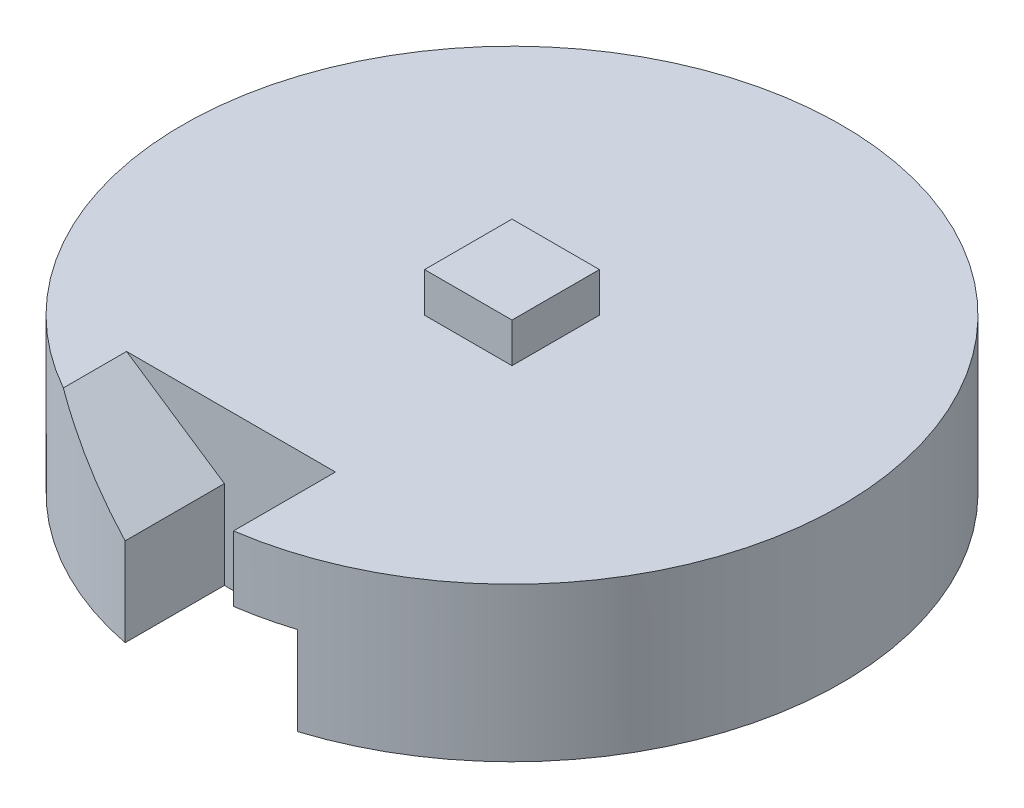
ISO-10303-21;
HEADER;
FILE_DESCRIPTION(('STEP AP214'),'2;1');
FILE_NAME('part.step','',(''),(''),'','','');
FILE_SCHEMA(('AUTOMOTIVE_DESIGN { 1 0 10303 214 1 1 1 1 }'));
ENDSEC;
DATA;
#1=APPLICATION_CONTEXT('core data for automotive mechanical design processes');
#2=APPLICATION_PROTOCOL_DEFINITION('international standard','automotive_design',2000,#1);
#3=PRODUCT_CONTEXT('',#1,'mechanical');
#4=PRODUCT('Part','Part','',(#3));
#5=PRODUCT_RELATED_PRODUCT_CATEGORY('part','',(#4));
#6=PRODUCT_DEFINITION_FORMATION('','',#4);
#7=PRODUCT_DEFINITION_CONTEXT('part definition',#1,'design');
#8=PRODUCT_DEFINITION('design','',#6,#7);
#9=PRODUCT_DEFINITION_SHAPE('','',#8);
#10=(LENGTH_UNIT() NAMED_UNIT(*) SI_UNIT(.MILLI.,.METRE.));
#11=(NAMED_UNIT(*) PLANE_ANGLE_UNIT() SI_UNIT($,.RADIAN.));
#12=(NAMED_UNIT(*) SI_UNIT($,.STERADIAN.) SOLID_ANGLE_UNIT());
#13=UNCERTAINTY_MEASURE_WITH_UNIT(LENGTH_MEASURE(1.E-05),#10,'distance_accuracy_value','');
#14=(GEOMETRIC_REPRESENTATION_CONTEXT(3) GLOBAL_UNCERTAINTY_ASSIGNED_CONTEXT((#13)) GLOBAL_UNIT_ASSIGNED_CONTEXT((#10,
#11,#12)) REPRESENTATION_CONTEXT('',''));
#15=CARTESIAN_POINT('',(0.,0.,0.));
#16=DIRECTION('',(0.,0.,1.));
#17=DIRECTION('',(1.,0.,0.));
#18=AXIS2_PLACEMENT_3D('',#15,#16,#17);
#19=CARTESIAN_POINT('',(0.,17.5,0.));
#20=DIRECTION('',(0.,1.,0.));
#21=DIRECTION('',(0.,0.,1.));
#22=AXIS2_PLACEMENT_3D('',#19,#20,#21);
#23=PLANE('',#22);
#24=DIRECTION('',(0.,0.,-1.));
#25=VECTOR('',#24,1.);
#26=CARTESIAN_POINT('',(5.40916797594821,17.5,0.));
#27=LINE('',#26,#25);
#28=CARTESIAN_POINT('',(5.40916797594821,17.5,37.1078280394848));
#29=VERTEX_POINT('',#28);
#30=CARTESIAN_POINT('',(5.40916797594821,17.5,25.5));
#31=VERTEX_POINT('',#30);
#32=EDGE_CURVE('E457',#29,#31,#27,.T.);
#33=ORIENTED_EDGE('',*,*,#32,.F.);
#34=CARTESIAN_POINT('',(0.,17.5,0.));
#35=DIRECTION('',(0.,1.,0.));
#36=DIRECTION('',(0.,0.,1.));
#37=AXIS2_PLACEMENT_3D('',#34,#35,#36);
#38=CIRCLE('',#37,37.5);
#39=CARTESIAN_POINT('',(-18.3618136354973,17.5,32.6969998626061));
#40=VERTEX_POINT('',#39);
#41=EDGE_CURVE('E436',#29,#40,#38,.T.);
#42=ORIENTED_EDGE('',*,*,#41,.T.);
#43=DIRECTION('',(0.,0.,1.));
#44=VECTOR('',#43,1.);
#45=CARTESIAN_POINT('',(-18.3618136354973,17.5,0.));
#46=LINE('',#45,#44);
#47=CARTESIAN_POINT('',(-18.3618136354973,17.5,25.5));
#48=VERTEX_POINT('',#47);
#49=EDGE_CURVE('E454',#48,#40,#46,.T.);
#50=ORIENTED_EDGE('',*,*,#49,.F.);
#51=DIRECTION('',(1.,0.,0.));
#52=VECTOR('',#51,1.);
#53=CARTESIAN_POINT('',(0.,17.5,25.5));
#54=LINE('',#53,#52);
#55=EDGE_CURVE('E408',#48,#31,#54,.T.);
#56=ORIENTED_EDGE('',*,*,#55,.T.);
#57=EDGE_LOOP('',(#33,#42,#50,#56));
#58=FACE_BOUND('',#57,.T.);
#59=DIRECTION('',(1.,0.,0.));
#60=VECTOR('',#59,1.);
#61=CARTESIAN_POINT('',(0.,17.5,-4.975));
#62=LINE('',#61,#60);
#63=CARTESIAN_POINT('',(-4.975,17.5,-4.975));
#64=VERTEX_POINT('',#63);
#65=CARTESIAN_POINT('',(4.975,17.5,-4.975));
#66=VERTEX_POINT('',#65);
#67=EDGE_CURVE('E378',#64,#66,#62,.T.);
#68=ORIENTED_EDGE('',*,*,#67,.T.);
#69=DIRECTION('',(0.,0.,1.));
#70=VECTOR('',#69,1.);
#71=CARTESIAN_POINT('',(4.975,17.5,0.));
#72=LINE('',#71,#70);
#73=CARTESIAN_POINT('',(4.975,17.5,4.975));
#74=VERTEX_POINT('',#73);
#75=EDGE_CURVE('E382',#66,#74,#72,.T.);
#76=ORIENTED_EDGE('',*,*,#75,.T.);
#77=DIRECTION('',(-1.,0.,0.));
#78=VECTOR('',#77,1.);
#79=CARTESIAN_POINT('',(0.,17.5,4.975));
#80=LINE('',#79,#78);
#81=CARTESIAN_POINT('',(-4.975,17.5,4.975));
#82=VERTEX_POINT('',#81);
#83=EDGE_CURVE('E370',#74,#82,#80,.T.);
#84=ORIENTED_EDGE('',*,*,#83,.T.);
#85=DIRECTION('',(0.,0.,-1.));
#86=VECTOR('',#85,1.);
#87=CARTESIAN_POINT('',(-4.975,17.5,0.));
#88=LINE('',#87,#86);
#89=EDGE_CURVE('E374',#82,#64,#88,.T.);
#90=ORIENTED_EDGE('',*,*,#89,.T.);
#91=EDGE_LOOP('',(#68,#76,#84,#90));
#92=FACE_BOUND('',#91,.T.);
#93=ADVANCED_FACE('F69',(#58,#92),#23,.T.);
#94=CARTESIAN_POINT('',(0.,17.5,0.));
#95=DIRECTION('',(0.,-1.,0.));
#96=DIRECTION('',(0.,0.,-1.));
#97=AXIS2_PLACEMENT_3D('',#94,#95,#96);
#98=CYLINDRICAL_SURFACE('',#97,37.5);
#99=ORIENTED_EDGE('',*,*,#41,.F.);
#100=DIRECTION('',(0.,-1.,0.));
#101=VECTOR('',#100,1.);
#102=CARTESIAN_POINT('',(5.40916797594821,17.5,37.1078280394848));
#103=LINE('',#102,#101);
#104=CARTESIAN_POINT('',(5.40916797594821,10.0586939101936,37.1078280394848));
#105=VERTEX_POINT('',#104);
#106=EDGE_CURVE('E431',#29,#105,#103,.T.);
#107=ORIENTED_EDGE('',*,*,#106,.T.);
#108=CARTESIAN_POINT('',(0.,10.0586939101936,0.));
#109=DIRECTION('',(0.,1.,0.));
#110=DIRECTION('',(0.,0.,1.));
#111=AXIS2_PLACEMENT_3D('',#108,#109,#110);
#112=CIRCLE('',#111,37.5);
#113=CARTESIAN_POINT('',(11.3377548552186,10.0586939101936,35.7450040543146));
#114=VERTEX_POINT('',#113);
#115=EDGE_CURVE('E78',#105,#114,#112,.T.);
#116=ORIENTED_EDGE('',*,*,#115,.T.);
#117=DIRECTION('',(0.,-1.,0.));
#118=VECTOR('',#117,1.);
#119=CARTESIAN_POINT('',(11.3377548552186,17.5,35.7450040543146));
#120=LINE('',#119,#118);
#121=CARTESIAN_POINT('',(11.3377548552186,0.,35.7450040543146));
#122=VERTEX_POINT('',#121);
#123=EDGE_CURVE('E423',#114,#122,#120,.T.);
#124=ORIENTED_EDGE('',*,*,#123,.T.);
#125=CARTESIAN_POINT('',(0.,0.,0.));
#126=DIRECTION('',(0.,1.,0.));
#127=DIRECTION('',(0.,0.,1.));
#128=AXIS2_PLACEMENT_3D('',#125,#126,#127);
#129=CIRCLE('',#128,37.5);
#130=CARTESIAN_POINT('',(-7.23202995206033,0.,36.7960288994954));
#131=VERTEX_POINT('',#130);
#132=EDGE_CURVE('E435',#122,#131,#129,.T.);
#133=ORIENTED_EDGE('',*,*,#132,.T.);
#134=DIRECTION('',(0.,-1.,0.));
#135=VECTOR('',#134,1.);
#136=CARTESIAN_POINT('',(-7.23202995206033,17.5,36.7960288994954));
#137=LINE('',#136,#135);
#138=CARTESIAN_POINT('',(-7.23202995206033,10.0401319165543,36.7960288994954));
#139=VERTEX_POINT('',#138);
#140=EDGE_CURVE('E419',#131,#139,#137,.F.);
#141=ORIENTED_EDGE('',*,*,#140,.T.);
#142=CARTESIAN_POINT('',(0.,5.19277899825944,0.));
#143=DIRECTION('',(-0.556765929579434,-0.830669428629433,0.));
#144=DIRECTION('',(0.830669428629433,-0.556765929579434,0.));
#145=AXIS2_PLACEMENT_3D('',#142,#143,#144);
#146=ELLIPSE('',#145,45.1443121746677,37.5);
#147=EDGE_CURVE('E427',#139,#40,#146,.T.);
#148=ORIENTED_EDGE('',*,*,#147,.T.);
#149=EDGE_LOOP('',(#99,#107,#116,#124,#133,#141,#148));
#150=FACE_BOUND('',#149,.T.);
#151=ADVANCED_FACE('F71',(#150),#98,.T.);
#152=CARTESIAN_POINT('',(0.,0.,0.));
#153=DIRECTION('',(0.,1.,0.));
#154=DIRECTION('',(0.,0.,1.));
#155=AXIS2_PLACEMENT_3D('',#152,#153,#154);
#156=PLANE('',#155);
#157=CARTESIAN_POINT('',(-29.9819884688496,0.,0.00676759727533257));
#158=DIRECTION('',(0.,-1.,0.));
#159=DIRECTION('',(0.,0.,-1.));
#160=AXIS2_PLACEMENT_3D('',#157,#158,#159);
#161=CIRCLE('',#160,3.025);
#162=CARTESIAN_POINT('',(-32.9953264854656,0.,0.272133378069444));
#163=VERTEX_POINT('',#162);
#164=CARTESIAN_POINT('',(-28.4488050560511,0.,2.61444350173884));
#165=VERTEX_POINT('',#164);
#166=EDGE_CURVE('E85',#163,#165,#161,.T.);
#167=ORIENTED_EDGE('',*,*,#166,.F.);
#168=DIRECTION('',(1.,0.,0.));
#169=VECTOR('',#168,1.);
#170=CARTESIAN_POINT('',(-33.1249528963565,0.,0.272133378069444));
#171=LINE('',#170,#169);
#172=CARTESIAN_POINT('',(-33.1249528963565,0.,0.272133378069444));
#173=VERTEX_POINT('',#172);
#174=EDGE_CURVE('E269',#173,#163,#171,.T.);
#175=ORIENTED_EDGE('',*,*,#174,.F.);
#176=DIRECTION('',(-0.5355378334719,0.,-0.844511236704535));
#177=VECTOR('',#176,1.);
#178=CARTESIAN_POINT('',(-29.9819884688496,0.,5.22840090894499));
#179=LINE('',#178,#177);
#180=CARTESIAN_POINT('',(-32.961379359042,0.,0.530079094796873));
#181=VERTEX_POINT('',#180);
#182=EDGE_CURVE('E245',#181,#173,#179,.T.);
#183=ORIENTED_EDGE('',*,*,#182,.F.);
#184=CARTESIAN_POINT('',(-31.7257499433556,0.,2.47859301991921));
#185=VERTEX_POINT('',#184);
#186=EDGE_CURVE('E224',#185,#181,#161,.T.);
#187=ORIENTED_EDGE('',*,*,#186,.F.);
#188=CARTESIAN_POINT('',(-29.9819884688496,0.,5.22840090894499));
#189=VERTEX_POINT('',#188);
#190=EDGE_CURVE('E237',#189,#185,#179,.T.);
#191=ORIENTED_EDGE('',*,*,#190,.F.);
#192=DIRECTION('',(-0.505931566726971,0.,0.862573619924231));
#193=VECTOR('',#192,1.);
#194=CARTESIAN_POINT('',(-27.0749528963565,0.,0.272133378069444));
#195=LINE('',#194,#193);
#196=EDGE_CURVE('E273',#165,#189,#195,.T.);
#197=ORIENTED_EDGE('',*,*,#196,.F.);
#198=EDGE_LOOP('',(#167,#175,#183,#187,#191,#197));
#199=FACE_BOUND('',#198,.T.);
#200=DIRECTION('',(-0.501278161939866,0.,0.865286197949666));
#201=VECTOR('',#200,1.);
#202=CARTESIAN_POINT('',(33.0430115311504,0.,0.00676759727533624));
#203=LINE('',#202,#201);
#204=CARTESIAN_POINT('',(31.5227687675417,0.,2.6309495001792));
#205=VERTEX_POINT('',#204);
#206=CARTESIAN_POINT('',(30.0180115311504,0.,5.22840090894499));
#207=VERTEX_POINT('',#206);
#208=EDGE_CURVE('E302',#205,#207,#203,.T.);
#209=ORIENTED_EDGE('',*,*,#208,.F.);
#210=CARTESIAN_POINT('',(30.0180115311504,0.,0.00676759727533624));
#211=DIRECTION('',(0.,-1.,0.));
#212=DIRECTION('',(0.,0.,-1.));
#213=AXIS2_PLACEMENT_3D('',#210,#211,#212);
#214=CIRCLE('',#213,3.025);
#215=CARTESIAN_POINT('',(28.5132542947592,0.,2.63094950017921));
#216=VERTEX_POINT('',#215);
#217=EDGE_CURVE('E301',#216,#205,#214,.T.);
#218=ORIENTED_EDGE('',*,*,#217,.F.);
#219=DIRECTION('',(-0.501278161939866,0.,-0.865286197949666));
#220=VECTOR('',#219,1.);
#221=CARTESIAN_POINT('',(30.0180115311504,0.,5.22840090894499));
#222=LINE('',#221,#220);
#223=EDGE_CURVE('E274',#207,#216,#222,.T.);
#224=ORIENTED_EDGE('',*,*,#223,.F.);
#225=EDGE_LOOP('',(#209,#218,#224));
#226=FACE_BOUND('',#225,.T.);
#227=CARTESIAN_POINT('',(0.,0.,0.));
#228=DIRECTION('',(0.,1.,0.));
#229=DIRECTION('',(0.,0.,1.));
#230=AXIS2_PLACEMENT_3D('',#227,#228,#229);
#231=CIRCLE('',#230,5.);
#232=CARTESIAN_POINT('',(0.,0.,5.));
#233=VERTEX_POINT('',#232);
#234=EDGE_CURVE('E12',#233,#233,#231,.F.);
#235=ORIENTED_EDGE('',*,*,#234,.F.);
#236=EDGE_LOOP('',(#235));
#237=FACE_BOUND('',#236,.T.);
#238=ORIENTED_EDGE('',*,*,#132,.F.);
#239=DIRECTION('',(0.,0.,-1.));
#240=VECTOR('',#239,1.);
#241=CARTESIAN_POINT('',(11.3377548552186,0.,0.));
#242=LINE('',#241,#240);
#243=CARTESIAN_POINT('',(11.3377548552186,0.,25.5));
#244=VERTEX_POINT('',#243);
#245=EDGE_CURVE('E450',#122,#244,#242,.T.);
#246=ORIENTED_EDGE('',*,*,#245,.T.);
#247=DIRECTION('',(1.,0.,0.));
#248=VECTOR('',#247,1.);
#249=CARTESIAN_POINT('',(0.,0.,25.5));
#250=LINE('',#249,#248);
#251=CARTESIAN_POINT('',(-7.23202995206033,0.,25.5));
#252=VERTEX_POINT('',#251);
#253=EDGE_CURVE('E440',#252,#244,#250,.T.);
#254=ORIENTED_EDGE('',*,*,#253,.F.);
#255=DIRECTION('',(0.,0.,1.));
#256=VECTOR('',#255,1.);
#257=CARTESIAN_POINT('',(-7.23202995206033,0.,0.));
#258=LINE('',#257,#256);
#259=EDGE_CURVE('E446',#252,#131,#258,.T.);
#260=ORIENTED_EDGE('',*,*,#259,.T.);
#261=EDGE_LOOP('',(#238,#246,#254,#260));
#262=FACE_BOUND('',#261,.T.);
#263=ADVANCED_FACE('F247',(#199,#226,#237,#262),#156,.F.);
#264=CARTESIAN_POINT('',(5.40916797594821,10.0586939101936,25.5));
#265=DIRECTION('',(0.,1.,0.));
#266=DIRECTION('',(0.,0.,1.));
#267=AXIS2_PLACEMENT_3D('',#264,#265,#266);
#268=PLANE('',#267);
#269=DIRECTION('',(0.,0.,1.));
#270=VECTOR('',#269,1.);
#271=CARTESIAN_POINT('',(5.40916797594821,10.0586939101936,25.5));
#272=LINE('',#271,#270);
#273=CARTESIAN_POINT('',(5.40916797594821,10.0586939101936,25.5));
#274=VERTEX_POINT('',#273);
#275=EDGE_CURVE('E404',#274,#105,#272,.T.);
#276=ORIENTED_EDGE('',*,*,#275,.F.);
#277=DIRECTION('',(-1.,0.,0.));
#278=VECTOR('',#277,1.);
#279=CARTESIAN_POINT('',(5.40916797594821,10.0586939101936,25.5));
#280=LINE('',#279,#278);
#281=CARTESIAN_POINT('',(11.3377548552186,10.0586939101936,25.5));
#282=VERTEX_POINT('',#281);
#283=EDGE_CURVE('E399',#282,#274,#280,.T.);
#284=ORIENTED_EDGE('',*,*,#283,.F.);
#285=DIRECTION('',(0.,0.,1.));
#286=VECTOR('',#285,1.);
#287=CARTESIAN_POINT('',(11.3377548552186,10.0586939101936,25.5));
#288=LINE('',#287,#286);
#289=EDGE_CURVE('E409',#282,#114,#288,.T.);
#290=ORIENTED_EDGE('',*,*,#289,.T.);
#291=ORIENTED_EDGE('',*,*,#115,.F.);
#292=EDGE_LOOP('',(#276,#284,#290,#291));
#293=FACE_BOUND('',#292,.T.);
#294=ADVANCED_FACE('F465',(#293),#268,.F.);
#295=CARTESIAN_POINT('',(5.40916797594821,17.669921882635,25.5));
#296=DIRECTION('',(1.,0.,0.));
#297=DIRECTION('',(0.,1.,0.));
#298=AXIS2_PLACEMENT_3D('',#295,#296,#297);
#299=PLANE('',#298);
#300=ORIENTED_EDGE('',*,*,#32,.T.);
#301=DIRECTION('',(0.,1.,0.));
#302=VECTOR('',#301,1.);
#303=CARTESIAN_POINT('',(5.40916797594821,17.669921882635,25.5));
#304=LINE('',#303,#302);
#305=EDGE_CURVE('E386',#274,#31,#304,.T.);
#306=ORIENTED_EDGE('',*,*,#305,.F.);
#307=ORIENTED_EDGE('',*,*,#275,.T.);
#308=ORIENTED_EDGE('',*,*,#106,.F.);
#309=EDGE_LOOP('',(#300,#306,#307,#308));
#310=FACE_BOUND('',#309,.T.);
#311=ADVANCED_FACE('F470',(#310),#299,.F.);
#312=CARTESIAN_POINT('',(-18.6153293512788,17.669921882635,25.5));
#313=DIRECTION('',(-0.556765929579434,-0.830669428629433,0.));
#314=DIRECTION('',(0.830669428629433,-0.556765929579434,0.));
#315=AXIS2_PLACEMENT_3D('',#312,#313,#314);
#316=PLANE('',#315);
#317=DIRECTION('',(0.,0.,1.));
#318=VECTOR('',#317,1.);
#319=CARTESIAN_POINT('',(-7.23202995206033,10.0401319165543,25.5));
#320=LINE('',#319,#318);
#321=CARTESIAN_POINT('',(-7.23202995206033,10.0401319165543,25.5));
#322=VERTEX_POINT('',#321);
#323=EDGE_CURVE('E403',#322,#139,#320,.T.);
#324=ORIENTED_EDGE('',*,*,#323,.F.);
#325=DIRECTION('',(0.830669428629433,-0.556765929579434,0.));
#326=VECTOR('',#325,1.);
#327=CARTESIAN_POINT('',(-18.6153293512788,17.669921882635,25.5));
#328=LINE('',#327,#326);
#329=EDGE_CURVE('E390',#48,#322,#328,.T.);
#330=ORIENTED_EDGE('',*,*,#329,.F.);
#331=ORIENTED_EDGE('',*,*,#49,.T.);
#332=ORIENTED_EDGE('',*,*,#147,.F.);
#333=EDGE_LOOP('',(#324,#330,#331,#332));
#334=FACE_BOUND('',#333,.T.);
#335=ADVANCED_FACE('F486',(#334),#316,.F.);
#336=CARTESIAN_POINT('',(11.3377548552186,10.0586939101936,25.5));
#337=DIRECTION('',(1.,0.,0.));
#338=DIRECTION('',(0.,1.,0.));
#339=AXIS2_PLACEMENT_3D('',#336,#337,#338);
#340=PLANE('',#339);
#341=ORIENTED_EDGE('',*,*,#289,.F.);
#342=DIRECTION('',(0.,1.,0.));
#343=VECTOR('',#342,1.);
#344=CARTESIAN_POINT('',(11.3377548552186,10.0586939101936,25.5));
#345=LINE('',#344,#343);
#346=EDGE_CURVE('E396',#244,#282,#345,.T.);
#347=ORIENTED_EDGE('',*,*,#346,.F.);
#348=ORIENTED_EDGE('',*,*,#245,.F.);
#349=ORIENTED_EDGE('',*,*,#123,.F.);
#350=EDGE_LOOP('',(#341,#347,#348,#349));
#351=FACE_BOUND('',#350,.T.);
#352=ADVANCED_FACE('F477',(#351),#340,.F.);
#353=CARTESIAN_POINT('',(-7.23202995206033,10.0401319165543,25.5));
#354=DIRECTION('',(-1.,0.,0.));
#355=DIRECTION('',(0.,0.,1.));
#356=AXIS2_PLACEMENT_3D('',#353,#354,#355);
#357=PLANE('',#356);
#358=ORIENTED_EDGE('',*,*,#259,.F.);
#359=DIRECTION('',(0.,-1.,0.));
#360=VECTOR('',#359,1.);
#361=CARTESIAN_POINT('',(-7.23202995206033,10.0401319165543,25.5));
#362=LINE('',#361,#360);
#363=EDGE_CURVE('E393',#322,#252,#362,.T.);
#364=ORIENTED_EDGE('',*,*,#363,.F.);
#365=ORIENTED_EDGE('',*,*,#323,.T.);
#366=ORIENTED_EDGE('',*,*,#140,.F.);
#367=EDGE_LOOP('',(#358,#364,#365,#366));
#368=FACE_BOUND('',#367,.T.);
#369=ADVANCED_FACE('F481',(#368),#357,.F.);
#370=CARTESIAN_POINT('',(0.,0.,25.5));
#371=DIRECTION('',(0.,0.,1.));
#372=DIRECTION('',(1.,0.,0.));
#373=AXIS2_PLACEMENT_3D('',#370,#371,#372);
#374=PLANE('',#373);
#375=ORIENTED_EDGE('',*,*,#329,.T.);
#376=ORIENTED_EDGE('',*,*,#363,.T.);
#377=ORIENTED_EDGE('',*,*,#253,.T.);
#378=ORIENTED_EDGE('',*,*,#346,.T.);
#379=ORIENTED_EDGE('',*,*,#283,.T.);
#380=ORIENTED_EDGE('',*,*,#305,.T.);
#381=ORIENTED_EDGE('',*,*,#55,.F.);
#382=EDGE_LOOP('',(#375,#376,#377,#378,#379,#380,#381));
#383=FACE_BOUND('',#382,.T.);
#384=ADVANCED_FACE('F473',(#383),#374,.T.);
#385=CARTESIAN_POINT('',(4.975,22.,-4.975));
#386=DIRECTION('',(-1.,0.,0.));
#387=DIRECTION('',(0.,0.,1.));
#388=AXIS2_PLACEMENT_3D('',#385,#386,#387);
#389=PLANE('',#388);
#390=ORIENTED_EDGE('',*,*,#75,.F.);
#391=DIRECTION('',(0.,-1.,0.));
#392=VECTOR('',#391,1.);
#393=CARTESIAN_POINT('',(4.975,22.,-4.975));
#394=LINE('',#393,#392);
#395=CARTESIAN_POINT('',(4.975,22.,-4.975));
#396=VERTEX_POINT('',#395);
#397=EDGE_CURVE('E366',#396,#66,#394,.T.);
#398=ORIENTED_EDGE('',*,*,#397,.F.);
#399=DIRECTION('',(0.,0.,-1.));
#400=VECTOR('',#399,1.);
#401=CARTESIAN_POINT('',(4.975,22.,-4.975));
#402=LINE('',#401,#400);
#403=CARTESIAN_POINT('',(4.975,22.,4.975));
#404=VERTEX_POINT('',#403);
#405=EDGE_CURVE('E342',#404,#396,#402,.T.);
#406=ORIENTED_EDGE('',*,*,#405,.F.);
#407=DIRECTION('',(0.,-1.,0.));
#408=VECTOR('',#407,1.);
#409=CARTESIAN_POINT('',(4.975,22.,4.975));
#410=LINE('',#409,#408);
#411=EDGE_CURVE('E355',#404,#74,#410,.T.);
#412=ORIENTED_EDGE('',*,*,#411,.T.);
#413=EDGE_LOOP('',(#390,#398,#406,#412));
#414=FACE_BOUND('',#413,.T.);
#415=ADVANCED_FACE('F507',(#414),#389,.F.);
#416=CARTESIAN_POINT('',(-4.975,22.,-4.975));
#417=DIRECTION('',(0.,0.,1.));
#418=DIRECTION('',(1.,0.,0.));
#419=AXIS2_PLACEMENT_3D('',#416,#417,#418);
#420=PLANE('',#419);
#421=ORIENTED_EDGE('',*,*,#67,.F.);
#422=DIRECTION('',(0.,-1.,0.));
#423=VECTOR('',#422,1.);
#424=CARTESIAN_POINT('',(-4.975,22.,-4.975));
#425=LINE('',#424,#423);
#426=CARTESIAN_POINT('',(-4.975,22.,-4.975));
#427=VERTEX_POINT('',#426);
#428=EDGE_CURVE('E362',#427,#64,#425,.T.);
#429=ORIENTED_EDGE('',*,*,#428,.F.);
#430=DIRECTION('',(-1.,0.,0.));
#431=VECTOR('',#430,1.);
#432=CARTESIAN_POINT('',(-4.975,22.,-4.975));
#433=LINE('',#432,#431);
#434=EDGE_CURVE('E346',#396,#427,#433,.T.);
#435=ORIENTED_EDGE('',*,*,#434,.F.);
#436=ORIENTED_EDGE('',*,*,#397,.T.);
#437=EDGE_LOOP('',(#421,#429,#435,#436));
#438=FACE_BOUND('',#437,.T.);
#439=ADVANCED_FACE('F495',(#438),#420,.F.);
#440=CARTESIAN_POINT('',(-4.975,22.,-4.975));
#441=DIRECTION('',(1.,0.,0.));
#442=DIRECTION('',(0.,0.,-1.));
#443=AXIS2_PLACEMENT_3D('',#440,#441,#442);
#444=PLANE('',#443);
#445=ORIENTED_EDGE('',*,*,#89,.F.);
#446=DIRECTION('',(0.,-1.,0.));
#447=VECTOR('',#446,1.);
#448=CARTESIAN_POINT('',(-4.975,22.,4.975));
#449=LINE('',#448,#447);
#450=CARTESIAN_POINT('',(-4.975,22.,4.975));
#451=VERTEX_POINT('',#450);
#452=EDGE_CURVE('E359',#451,#82,#449,.T.);
#453=ORIENTED_EDGE('',*,*,#452,.F.);
#454=DIRECTION('',(0.,0.,1.));
#455=VECTOR('',#454,1.);
#456=CARTESIAN_POINT('',(-4.975,22.,-4.975));
#457=LINE('',#456,#455);
#458=EDGE_CURVE('E349',#427,#451,#457,.T.);
#459=ORIENTED_EDGE('',*,*,#458,.F.);
#460=ORIENTED_EDGE('',*,*,#428,.T.);
#461=EDGE_LOOP('',(#445,#453,#459,#460));
#462=FACE_BOUND('',#461,.T.);
#463=ADVANCED_FACE('F499',(#462),#444,.F.);
#464=CARTESIAN_POINT('',(-4.975,22.,4.975));
#465=DIRECTION('',(0.,0.,-1.));
#466=DIRECTION('',(-1.,0.,0.));
#467=AXIS2_PLACEMENT_3D('',#464,#465,#466);
#468=PLANE('',#467);
#469=ORIENTED_EDGE('',*,*,#83,.F.);
#470=ORIENTED_EDGE('',*,*,#411,.F.);
#471=DIRECTION('',(1.,0.,0.));
#472=VECTOR('',#471,1.);
#473=CARTESIAN_POINT('',(-4.975,22.,4.975));
#474=LINE('',#473,#472);
#475=EDGE_CURVE('E352',#451,#404,#474,.T.);
#476=ORIENTED_EDGE('',*,*,#475,.F.);
#477=ORIENTED_EDGE('',*,*,#452,.T.);
#478=EDGE_LOOP('',(#469,#470,#476,#477));
#479=FACE_BOUND('',#478,.T.);
#480=ADVANCED_FACE('F509',(#479),#468,.F.);
#481=CARTESIAN_POINT('',(0.,22.,0.));
#482=DIRECTION('',(0.,1.,0.));
#483=DIRECTION('',(0.,0.,1.));
#484=AXIS2_PLACEMENT_3D('',#481,#482,#483);
#485=PLANE('',#484);
#486=ORIENTED_EDGE('',*,*,#405,.T.);
#487=ORIENTED_EDGE('',*,*,#434,.T.);
#488=ORIENTED_EDGE('',*,*,#458,.T.);
#489=ORIENTED_EDGE('',*,*,#475,.T.);
#490=EDGE_LOOP('',(#486,#487,#488,#489));
#491=FACE_BOUND('',#490,.T.);
#492=ADVANCED_FACE('F503',(#491),#485,.T.);
#493=CARTESIAN_POINT('',(0.,-10.,0.));
#494=DIRECTION('',(0.,1.,0.));
#495=DIRECTION('',(0.,0.,1.));
#496=AXIS2_PLACEMENT_3D('',#493,#494,#495);
#497=CYLINDRICAL_SURFACE('',#496,5.);
#498=CARTESIAN_POINT('',(0.,-10.,0.));
#499=DIRECTION('',(0.,-1.,0.));
#500=DIRECTION('',(0.,0.,-1.));
#501=AXIS2_PLACEMENT_3D('',#498,#499,#500);
#502=CIRCLE('',#501,5.);
#503=CARTESIAN_POINT('',(0.,-10.,-5.));
#504=VERTEX_POINT('',#503);
#505=EDGE_CURVE('E338',#504,#504,#502,.T.);
#506=ORIENTED_EDGE('',*,*,#505,.F.);
#507=EDGE_LOOP('',(#506));
#508=FACE_BOUND('',#507,.T.);
#509=ORIENTED_EDGE('',*,*,#234,.T.);
#510=EDGE_LOOP('',(#509));
#511=FACE_BOUND('',#510,.T.);
#512=ADVANCED_FACE('F516',(#508,#511),#497,.T.);
#513=CARTESIAN_POINT('',(0.,-10.,0.));
#514=DIRECTION('',(0.,-1.,0.));
#515=DIRECTION('',(0.,0.,-1.));
#516=AXIS2_PLACEMENT_3D('',#513,#514,#515);
#517=PLANE('',#516);
#518=CARTESIAN_POINT('',(0.0180115311504414,-10.,0.00676759727533257));
#519=DIRECTION('',(0.,-1.,0.));
#520=DIRECTION('',(0.,0.,-1.));
#521=AXIS2_PLACEMENT_3D('',#518,#519,#520);
#522=CIRCLE('',#521,1.55);
#523=CARTESIAN_POINT('',(0.565734088655607,-10.,-1.44323240272467));
#524=VERTEX_POINT('',#523);
#525=CARTESIAN_POINT('',(-0.529711026354725,-10.,-1.44323240272467));
#526=VERTEX_POINT('',#525);
#527=EDGE_CURVE('E289',#524,#526,#522,.T.);
#528=ORIENTED_EDGE('',*,*,#527,.F.);
#529=DIRECTION('',(1.,0.,0.));
#530=VECTOR('',#529,1.);
#531=CARTESIAN_POINT('',(0.0180115311504414,-10.,-1.44323240272467));
#532=LINE('',#531,#530);
#533=EDGE_CURVE('E322',#526,#524,#532,.T.);
#534=ORIENTED_EDGE('',*,*,#533,.F.);
#535=EDGE_LOOP('',(#528,#534));
#536=FACE_BOUND('',#535,.T.);
#537=ORIENTED_EDGE('',*,*,#505,.T.);
#538=EDGE_LOOP('',(#537));
#539=FACE_BOUND('',#538,.T.);
#540=ADVANCED_FACE('F613',(#536,#539),#517,.T.);
#541=CARTESIAN_POINT('',(0.0180115311504414,0.,0.00676759727533257));
#542=DIRECTION('',(0.,-1.,0.));
#543=DIRECTION('',(0.,0.,-1.));
#544=AXIS2_PLACEMENT_3D('',#541,#542,#543);
#545=CYLINDRICAL_SURFACE('',#544,1.55);
#546=ORIENTED_EDGE('',*,*,#527,.T.);
#547=DIRECTION('',(0.,-1.,0.));
#548=VECTOR('',#547,1.);
#549=CARTESIAN_POINT('',(-0.529711026354725,0.,-1.44323240272467));
#550=LINE('',#549,#548);
#551=CARTESIAN_POINT('',(-0.529711026354725,0.,-1.44323240272467));
#552=VERTEX_POINT('',#551);
#553=EDGE_CURVE('E334',#552,#526,#550,.T.);
#554=ORIENTED_EDGE('',*,*,#553,.F.);
#555=CARTESIAN_POINT('',(0.0180115311504414,0.,0.00676759727533257));
#556=DIRECTION('',(0.,-1.,0.));
#557=DIRECTION('',(0.,0.,-1.));
#558=AXIS2_PLACEMENT_3D('',#555,#556,#557);
#559=CIRCLE('',#558,1.55);
#560=CARTESIAN_POINT('',(0.565734088655607,0.,-1.44323240272467));
#561=VERTEX_POINT('',#560);
#562=EDGE_CURVE('E321',#561,#552,#559,.T.);
#563=ORIENTED_EDGE('',*,*,#562,.F.);
#564=DIRECTION('',(0.,-1.,0.));
#565=VECTOR('',#564,1.);
#566=CARTESIAN_POINT('',(0.565734088655607,0.,-1.44323240272467));
#567=LINE('',#566,#565);
#568=EDGE_CURVE('E326',#561,#524,#567,.T.);
#569=ORIENTED_EDGE('',*,*,#568,.T.);
#570=EDGE_LOOP('',(#546,#554,#563,#569));
#571=FACE_BOUND('',#570,.T.);
#572=ADVANCED_FACE('F622',(#571),#545,.F.);
#573=CARTESIAN_POINT('',(0.0180115311504414,0.,-1.44323240272467));
#574=DIRECTION('',(0.,0.,-1.));
#575=DIRECTION('',(-1.,0.,0.));
#576=AXIS2_PLACEMENT_3D('',#573,#574,#575);
#577=PLANE('',#576);
#578=ORIENTED_EDGE('',*,*,#533,.T.);
#579=ORIENTED_EDGE('',*,*,#568,.F.);
#580=DIRECTION('',(-1.,0.,0.));
#581=VECTOR('',#580,1.);
#582=CARTESIAN_POINT('',(0.0180115311504414,0.,-1.44323240272467));
#583=LINE('',#582,#581);
#584=EDGE_CURVE('E318',#561,#552,#583,.T.);
#585=ORIENTED_EDGE('',*,*,#584,.T.);
#586=ORIENTED_EDGE('',*,*,#553,.T.);
#587=EDGE_LOOP('',(#578,#579,#585,#586));
#588=FACE_BOUND('',#587,.T.);
#589=ADVANCED_FACE('F632',(#588),#577,.F.);
#590=CARTESIAN_POINT('',(0.0180115311504414,0.,0.00676759727533257));
#591=DIRECTION('',(0.,-1.,0.));
#592=DIRECTION('',(0.,0.,-1.));
#593=AXIS2_PLACEMENT_3D('',#590,#591,#592);
#594=PLANE('',#593);
#595=ORIENTED_EDGE('',*,*,#584,.F.);
#596=ORIENTED_EDGE('',*,*,#562,.T.);
#597=EDGE_LOOP('',(#595,#596));
#598=FACE_BOUND('',#597,.T.);
#599=ADVANCED_FACE('F642',(#598),#594,.T.);
#600=CARTESIAN_POINT('',(30.0180115311504,1.6,0.00676759727533624));
#601=DIRECTION('',(0.,-1.,0.));
#602=DIRECTION('',(0.,0.,-1.));
#603=AXIS2_PLACEMENT_3D('',#600,#601,#602);
#604=PLANE('',#603);
#605=CARTESIAN_POINT('',(30.0180115311504,1.6,0.00676759727533624));
#606=DIRECTION('',(0.,-1.,0.));
#607=DIRECTION('',(0.,0.,-1.));
#608=AXIS2_PLACEMENT_3D('',#605,#606,#607);
#609=CIRCLE('',#608,3.025);
#610=CARTESIAN_POINT('',(28.5132542947592,1.6,2.63094950017921));
#611=VERTEX_POINT('',#610);
#612=CARTESIAN_POINT('',(31.5227687675417,1.6,2.63094950017921));
#613=VERTEX_POINT('',#612);
#614=EDGE_CURVE('E295',#611,#613,#609,.T.);
#615=ORIENTED_EDGE('',*,*,#614,.T.);
#616=DIRECTION('',(-0.501278161939866,0.,0.865286197949666));
#617=VECTOR('',#616,1.);
#618=CARTESIAN_POINT('',(33.0430115311504,1.6,0.00676759727533624));
#619=LINE('',#618,#617);
#620=CARTESIAN_POINT('',(30.0180115311504,1.6,5.22840090894499));
#621=VERTEX_POINT('',#620);
#622=EDGE_CURVE('E300',#613,#621,#619,.T.);
#623=ORIENTED_EDGE('',*,*,#622,.T.);
#624=DIRECTION('',(-0.501278161939866,0.,-0.865286197949666));
#625=VECTOR('',#624,1.);
#626=CARTESIAN_POINT('',(30.0180115311504,1.6,5.22840090894499));
#627=LINE('',#626,#625);
#628=EDGE_CURVE('E305',#621,#611,#627,.T.);
#629=ORIENTED_EDGE('',*,*,#628,.T.);
#630=EDGE_LOOP('',(#615,#623,#629));
#631=FACE_BOUND('',#630,.T.);
#632=ADVANCED_FACE('F654',(#631),#604,.T.);
#633=CARTESIAN_POINT('',(30.0180115311504,1.6,0.00676759727533624));
#634=DIRECTION('',(0.,-1.,0.));
#635=DIRECTION('',(0.,0.,-1.));
#636=AXIS2_PLACEMENT_3D('',#633,#634,#635);
#637=CYLINDRICAL_SURFACE('',#636,3.025);
#638=DIRECTION('',(0.,-1.,0.));
#639=VECTOR('',#638,1.);
#640=CARTESIAN_POINT('',(31.5227687675417,1.6,2.6309495001792));
#641=LINE('',#640,#639);
#642=EDGE_CURVE('E93',#205,#613,#641,.F.);
#643=ORIENTED_EDGE('',*,*,#642,.T.);
#644=ORIENTED_EDGE('',*,*,#614,.F.);
#645=DIRECTION('',(0.,-1.,0.));
#646=VECTOR('',#645,1.);
#647=CARTESIAN_POINT('',(28.5132542947592,1.6,2.6309495001792));
#648=LINE('',#647,#646);
#649=EDGE_CURVE('E290',#611,#216,#648,.T.);
#650=ORIENTED_EDGE('',*,*,#649,.T.);
#651=ORIENTED_EDGE('',*,*,#217,.T.);
#652=EDGE_LOOP('',(#643,#644,#650,#651));
#653=FACE_BOUND('',#652,.T.);
#654=ADVANCED_FACE('F657',(#653),#637,.F.);
#655=CARTESIAN_POINT('',(30.0180115311504,1.6,5.22840090894499));
#656=DIRECTION('',(-0.865286197949666,0.,0.501278161939866));
#657=DIRECTION('',(0.501278161939866,0.,0.865286197949666));
#658=AXIS2_PLACEMENT_3D('',#655,#656,#657);
#659=PLANE('',#658);
#660=ORIENTED_EDGE('',*,*,#628,.F.);
#661=DIRECTION('',(0.,-1.,0.));
#662=VECTOR('',#661,1.);
#663=CARTESIAN_POINT('',(30.0180115311504,1.6,5.22840090894499));
#664=LINE('',#663,#662);
#665=EDGE_CURVE('E296',#621,#207,#664,.T.);
#666=ORIENTED_EDGE('',*,*,#665,.T.);
#667=ORIENTED_EDGE('',*,*,#223,.T.);
#668=ORIENTED_EDGE('',*,*,#649,.F.);
#669=EDGE_LOOP('',(#660,#666,#667,#668));
#670=FACE_BOUND('',#669,.T.);
#671=ADVANCED_FACE('F674',(#670),#659,.F.);
#672=CARTESIAN_POINT('',(33.0430115311504,1.6,0.00676759727533624));
#673=DIRECTION('',(0.865286197949666,0.,0.501278161939866));
#674=DIRECTION('',(0.501278161939866,0.,-0.865286197949666));
#675=AXIS2_PLACEMENT_3D('',#672,#673,#674);
#676=PLANE('',#675);
#677=ORIENTED_EDGE('',*,*,#208,.T.);
#678=ORIENTED_EDGE('',*,*,#665,.F.);
#679=ORIENTED_EDGE('',*,*,#622,.F.);
#680=ORIENTED_EDGE('',*,*,#642,.F.);
#681=EDGE_LOOP('',(#677,#678,#679,#680));
#682=FACE_BOUND('',#681,.T.);
#683=ADVANCED_FACE('F666',(#682),#676,.F.);
#684=CARTESIAN_POINT('',(-29.9819884688496,1.6,0.00676759727533257));
#685=DIRECTION('',(0.,-1.,0.));
#686=DIRECTION('',(0.,0.,-1.));
#687=AXIS2_PLACEMENT_3D('',#684,#685,#686);
#688=PLANE('',#687);
#689=CARTESIAN_POINT('',(-29.9819884688496,1.6,0.00676759727533257));
#690=DIRECTION('',(0.,-1.,0.));
#691=DIRECTION('',(0.,0.,-1.));
#692=AXIS2_PLACEMENT_3D('',#689,#690,#691);
#693=CIRCLE('',#692,3.025);
#694=CARTESIAN_POINT('',(-31.7257499433556,1.6,2.47859301991921));
#695=VERTEX_POINT('',#694);
#696=CARTESIAN_POINT('',(-32.961379359042,1.6,0.530079094796873));
#697=VERTEX_POINT('',#696);
#698=EDGE_CURVE('E227',#695,#697,#693,.T.);
#699=ORIENTED_EDGE('',*,*,#698,.T.);
#700=DIRECTION('',(-0.5355378334719,0.,-0.844511236704535));
#701=VECTOR('',#700,1.);
#702=CARTESIAN_POINT('',(-29.9819884688496,1.6,5.22840090894499));
#703=LINE('',#702,#701);
#704=CARTESIAN_POINT('',(-33.1249528963565,1.6,0.272133378069444));
#705=VERTEX_POINT('',#704);
#706=EDGE_CURVE('E265',#697,#705,#703,.T.);
#707=ORIENTED_EDGE('',*,*,#706,.T.);
#708=DIRECTION('',(1.,0.,0.));
#709=VECTOR('',#708,1.);
#710=CARTESIAN_POINT('',(-33.1249528963565,1.6,0.272133378069444));
#711=LINE('',#710,#709);
#712=CARTESIAN_POINT('',(-32.9953264854656,1.6,0.272133378069444));
#713=VERTEX_POINT('',#712);
#714=EDGE_CURVE('E244',#705,#713,#711,.T.);
#715=ORIENTED_EDGE('',*,*,#714,.T.);
#716=CARTESIAN_POINT('',(-28.4488050560511,1.6,2.61444350173884));
#717=VERTEX_POINT('',#716);
#718=EDGE_CURVE('E251',#713,#717,#693,.T.);
#719=ORIENTED_EDGE('',*,*,#718,.T.);
#720=DIRECTION('',(-0.505931566726971,0.,0.862573619924231));
#721=VECTOR('',#720,1.);
#722=CARTESIAN_POINT('',(-27.0749528963565,1.6,0.272133378069444));
#723=LINE('',#722,#721);
#724=CARTESIAN_POINT('',(-29.9819884688496,1.6,5.22840090894499));
#725=VERTEX_POINT('',#724);
#726=EDGE_CURVE('E262',#717,#725,#723,.T.);
#727=ORIENTED_EDGE('',*,*,#726,.T.);
#728=EDGE_CURVE('E266',#725,#695,#703,.T.);
#729=ORIENTED_EDGE('',*,*,#728,.T.);
#730=EDGE_LOOP('',(#699,#707,#715,#719,#727,#729));
#731=FACE_BOUND('',#730,.T.);
#732=ADVANCED_FACE('F693',(#731),#688,.T.);
#733=CARTESIAN_POINT('',(-29.9819884688496,1.6,0.00676759727533257));
#734=DIRECTION('',(0.,-1.,0.));
#735=DIRECTION('',(0.,0.,-1.));
#736=AXIS2_PLACEMENT_3D('',#733,#734,#735);
#737=CYLINDRICAL_SURFACE('',#736,3.025);
#738=DIRECTION('',(0.,-1.,0.));
#739=VECTOR('',#738,1.);
#740=CARTESIAN_POINT('',(-32.961379359042,1.6,0.53007909479687));
#741=LINE('',#740,#739);
#742=EDGE_CURVE('E232',#181,#697,#741,.F.);
#743=ORIENTED_EDGE('',*,*,#742,.T.);
#744=ORIENTED_EDGE('',*,*,#698,.F.);
#745=DIRECTION('',(0.,-1.,0.));
#746=VECTOR('',#745,1.);
#747=CARTESIAN_POINT('',(-31.7257499433556,1.6,2.47859301991921));
#748=LINE('',#747,#746);
#749=EDGE_CURVE('E220',#695,#185,#748,.T.);
#750=ORIENTED_EDGE('',*,*,#749,.T.);
#751=ORIENTED_EDGE('',*,*,#186,.T.);
#752=EDGE_LOOP('',(#743,#744,#750,#751));
#753=FACE_BOUND('',#752,.T.);
#754=ADVANCED_FACE('F222',(#753),#737,.F.);
#755=DIRECTION('',(0.,-1.,0.));
#756=VECTOR('',#755,1.);
#757=CARTESIAN_POINT('',(-32.9953264854656,1.6,0.272133378069444));
#758=LINE('',#757,#756);
#759=EDGE_CURVE('E286',#713,#163,#758,.T.);
#760=ORIENTED_EDGE('',*,*,#759,.T.);
#761=ORIENTED_EDGE('',*,*,#166,.T.);
#762=DIRECTION('',(0.,-1.,0.));
#763=VECTOR('',#762,1.);
#764=CARTESIAN_POINT('',(-28.4488050560511,1.6,2.61444350173884));
#765=LINE('',#764,#763);
#766=EDGE_CURVE('E233',#165,#717,#765,.F.);
#767=ORIENTED_EDGE('',*,*,#766,.T.);
#768=ORIENTED_EDGE('',*,*,#718,.F.);
#769=EDGE_LOOP('',(#760,#761,#767,#768));
#770=FACE_BOUND('',#769,.T.);
#771=ADVANCED_FACE('F712',(#770),#737,.F.);
#772=CARTESIAN_POINT('',(-33.1249528963565,1.6,0.272133378069444));
#773=DIRECTION('',(0.,0.,-1.));
#774=DIRECTION('',(-1.,0.,0.));
#775=AXIS2_PLACEMENT_3D('',#772,#773,#774);
#776=PLANE('',#775);
#777=ORIENTED_EDGE('',*,*,#714,.F.);
#778=DIRECTION('',(0.,-1.,0.));
#779=VECTOR('',#778,1.);
#780=CARTESIAN_POINT('',(-33.1249528963565,1.6,0.272133378069444));
#781=LINE('',#780,#779);
#782=EDGE_CURVE('E257',#705,#173,#781,.T.);
#783=ORIENTED_EDGE('',*,*,#782,.T.);
#784=ORIENTED_EDGE('',*,*,#174,.T.);
#785=ORIENTED_EDGE('',*,*,#759,.F.);
#786=EDGE_LOOP('',(#777,#783,#784,#785));
#787=FACE_BOUND('',#786,.T.);
#788=ADVANCED_FACE('F721',(#787),#776,.F.);
#789=CARTESIAN_POINT('',(-29.9819884688496,1.6,5.22840090894499));
#790=DIRECTION('',(-0.844511236704535,0.,0.5355378334719));
#791=DIRECTION('',(0.5355378334719,0.,0.844511236704535));
#792=AXIS2_PLACEMENT_3D('',#789,#790,#791);
#793=PLANE('',#792);
#794=ORIENTED_EDGE('',*,*,#182,.T.);
#795=ORIENTED_EDGE('',*,*,#782,.F.);
#796=ORIENTED_EDGE('',*,*,#706,.F.);
#797=ORIENTED_EDGE('',*,*,#742,.F.);
#798=EDGE_LOOP('',(#794,#795,#796,#797));
#799=FACE_BOUND('',#798,.T.);
#800=ADVANCED_FACE('F729',(#799),#793,.F.);
#801=ORIENTED_EDGE('',*,*,#728,.F.);
#802=DIRECTION('',(0.,-1.,0.));
#803=VECTOR('',#802,1.);
#804=CARTESIAN_POINT('',(-29.9819884688496,1.6,5.22840090894499));
#805=LINE('',#804,#803);
#806=EDGE_CURVE('E240',#725,#189,#805,.T.);
#807=ORIENTED_EDGE('',*,*,#806,.T.);
#808=ORIENTED_EDGE('',*,*,#190,.T.);
#809=ORIENTED_EDGE('',*,*,#749,.F.);
#810=EDGE_LOOP('',(#801,#807,#808,#809));
#811=FACE_BOUND('',#810,.T.);
#812=ADVANCED_FACE('F238',(#811),#793,.F.);
#813=CARTESIAN_POINT('',(-27.0749528963565,1.6,0.272133378069444));
#814=DIRECTION('',(0.862573619924232,0.,0.505931566726971));
#815=DIRECTION('',(0.505931566726971,0.,-0.862573619924232));
#816=AXIS2_PLACEMENT_3D('',#813,#814,#815);
#817=PLANE('',#816);
#818=ORIENTED_EDGE('',*,*,#196,.T.);
#819=ORIENTED_EDGE('',*,*,#806,.F.);
#820=ORIENTED_EDGE('',*,*,#726,.F.);
#821=ORIENTED_EDGE('',*,*,#766,.F.);
#822=EDGE_LOOP('',(#818,#819,#820,#821));
#823=FACE_BOUND('',#822,.T.);
#824=ADVANCED_FACE('F704',(#823),#817,.F.);
#825=CLOSED_SHELL('',(#93,#151,#263,#294,#311,#335,#352,#369,#384,#415,#439,#463,#480,#492,#512,
#540,#572,#589,#599,#632,#654,#671,#683,#732,#754,#771,#788,#800,#812,#824));
#826=MANIFOLD_SOLID_BREP('B2',#825);
#827=ADVANCED_BREP_SHAPE_REPRESENTATION('',(#18,#826),#14);
#828=SHAPE_DEFINITION_REPRESENTATION(#9,#827);
ENDSEC;
END-ISO-10303-21;
